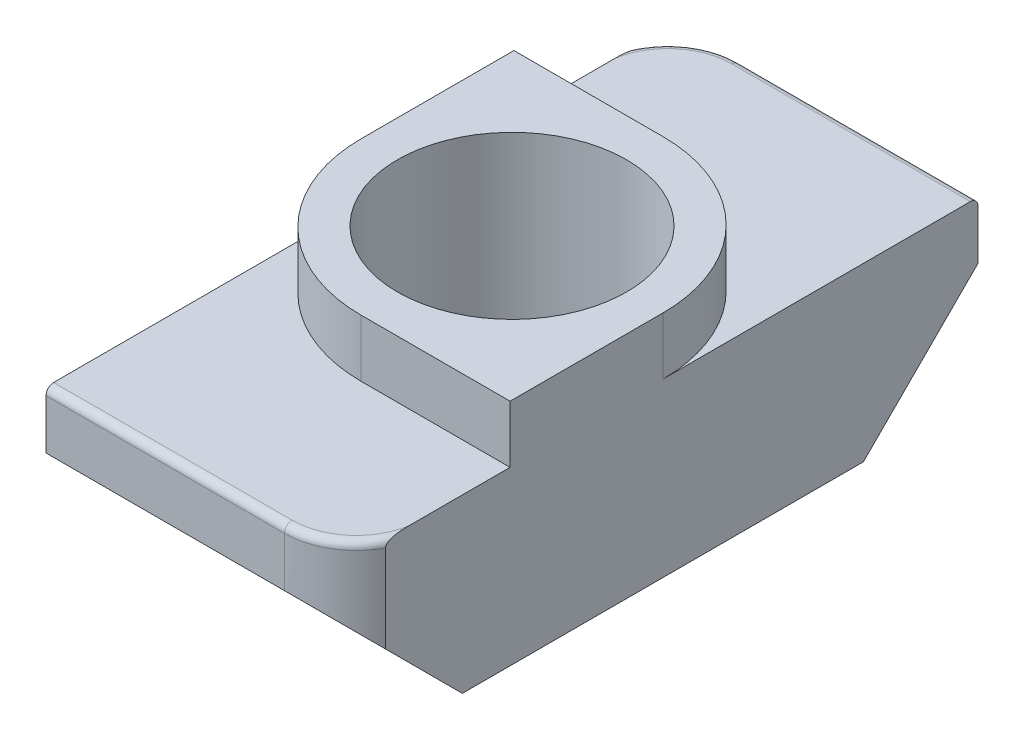
ISO-10303-21;
HEADER;
FILE_DESCRIPTION(('STEP AP214'),'2;1');
FILE_NAME('part.step','',(''),(''),'','','');
FILE_SCHEMA(('AUTOMOTIVE_DESIGN { 1 0 10303 214 1 1 1 1 }'));
ENDSEC;
DATA;
#1=APPLICATION_CONTEXT('core data for automotive mechanical design processes');
#2=APPLICATION_PROTOCOL_DEFINITION('international standard','automotive_design',2000,#1);
#3=PRODUCT_CONTEXT('',#1,'mechanical');
#4=PRODUCT('Part','Part','',(#3));
#5=PRODUCT_RELATED_PRODUCT_CATEGORY('part','',(#4));
#6=PRODUCT_DEFINITION_FORMATION('','',#4);
#7=PRODUCT_DEFINITION_CONTEXT('part definition',#1,'design');
#8=PRODUCT_DEFINITION('design','',#6,#7);
#9=PRODUCT_DEFINITION_SHAPE('','',#8);
#10=(LENGTH_UNIT() NAMED_UNIT(*) SI_UNIT(.MILLI.,.METRE.));
#11=(NAMED_UNIT(*) PLANE_ANGLE_UNIT() SI_UNIT($,.RADIAN.));
#12=(NAMED_UNIT(*) SI_UNIT($,.STERADIAN.) SOLID_ANGLE_UNIT());
#13=UNCERTAINTY_MEASURE_WITH_UNIT(LENGTH_MEASURE(1.E-05),#10,'distance_accuracy_value','');
#14=(GEOMETRIC_REPRESENTATION_CONTEXT(3) GLOBAL_UNCERTAINTY_ASSIGNED_CONTEXT((#13)) GLOBAL_UNIT_ASSIGNED_CONTEXT((#10,
#11,#12)) REPRESENTATION_CONTEXT('',''));
#15=CARTESIAN_POINT('',(0.,0.,0.));
#16=DIRECTION('',(0.,0.,1.));
#17=DIRECTION('',(1.,0.,0.));
#18=AXIS2_PLACEMENT_3D('',#15,#16,#17);
#19=CARTESIAN_POINT('',(-3.95,-1.5,4.));
#20=DIRECTION('',(0.,0.,1.));
#21=DIRECTION('',(-1.,0.,0.));
#22=AXIS2_PLACEMENT_3D('',#19,#20,#21);
#23=PLANE('',#22);
#24=DIRECTION('',(0.,1.,0.));
#25=VECTOR('',#24,1.);
#26=CARTESIAN_POINT('',(3.95,-1.5,4.));
#27=LINE('',#26,#25);
#28=CARTESIAN_POINT('',(3.95,0.,4.));
#29=VERTEX_POINT('',#28);
#30=CARTESIAN_POINT('',(3.95,-1.5,4.));
#31=VERTEX_POINT('',#30);
#32=EDGE_CURVE('E331',#29,#31,#27,.F.);
#33=ORIENTED_EDGE('',*,*,#32,.F.);
#34=DIRECTION('',(1.,0.,0.));
#35=VECTOR('',#34,1.);
#36=CARTESIAN_POINT('',(-3.95,0.,4.));
#37=LINE('',#36,#35);
#38=CARTESIAN_POINT('',(0.0500000000000003,0.,4.));
#39=VERTEX_POINT('',#38);
#40=EDGE_CURVE('E224',#29,#39,#37,.F.);
#41=ORIENTED_EDGE('',*,*,#40,.T.);
#42=DIRECTION('',(0.,1.,0.));
#43=VECTOR('',#42,1.);
#44=CARTESIAN_POINT('',(0.0500000000000005,0.,4.));
#45=LINE('',#44,#43);
#46=CARTESIAN_POINT('',(0.0500000000000003,-1.5,4.));
#47=VERTEX_POINT('',#46);
#48=EDGE_CURVE('E329',#39,#47,#45,.F.);
#49=ORIENTED_EDGE('',*,*,#48,.T.);
#50=DIRECTION('',(1.,0.,0.));
#51=VECTOR('',#50,1.);
#52=CARTESIAN_POINT('',(-3.95,-1.5,4.));
#53=LINE('',#52,#51);
#54=EDGE_CURVE('E237',#47,#31,#53,.T.);
#55=ORIENTED_EDGE('',*,*,#54,.T.);
#56=EDGE_LOOP('',(#33,#41,#49,#55));
#57=FACE_BOUND('',#56,.T.);
#58=ADVANCED_FACE('F33',(#57),#23,.T.);
#59=CARTESIAN_POINT('',(0.05,0.,0.));
#60=DIRECTION('',(0.,1.,0.));
#61=DIRECTION('',(0.,0.,-1.));
#62=AXIS2_PLACEMENT_3D('',#59,#60,#61);
#63=CYLINDRICAL_SURFACE('',#62,4.);
#64=CARTESIAN_POINT('',(0.05,-1.5,0.));
#65=DIRECTION('',(0.,-1.,0.));
#66=DIRECTION('',(0.,0.,-1.));
#67=AXIS2_PLACEMENT_3D('',#64,#65,#66);
#68=CIRCLE('',#67,4.);
#69=CARTESIAN_POINT('',(-3.95,-1.5,0.));
#70=VERTEX_POINT('',#69);
#71=EDGE_CURVE('E215',#70,#47,#68,.F.);
#72=ORIENTED_EDGE('',*,*,#71,.T.);
#73=ORIENTED_EDGE('',*,*,#48,.F.);
#74=CARTESIAN_POINT('',(0.05,0.,0.));
#75=DIRECTION('',(0.,-1.,0.));
#76=DIRECTION('',(0.,0.,-1.));
#77=AXIS2_PLACEMENT_3D('',#74,#75,#76);
#78=CIRCLE('',#77,4.);
#79=CARTESIAN_POINT('',(-3.95,0.,0.));
#80=VERTEX_POINT('',#79);
#81=EDGE_CURVE('E227',#39,#80,#78,.T.);
#82=ORIENTED_EDGE('',*,*,#81,.T.);
#83=DIRECTION('',(0.,1.,0.));
#84=VECTOR('',#83,1.);
#85=CARTESIAN_POINT('',(-3.95,0.,0.));
#86=LINE('',#85,#84);
#87=EDGE_CURVE('E276',#70,#80,#86,.T.);
#88=ORIENTED_EDGE('',*,*,#87,.F.);
#89=EDGE_LOOP('',(#72,#73,#82,#88));
#90=FACE_BOUND('',#89,.T.);
#91=ADVANCED_FACE('F433',(#90),#63,.T.);
#92=CARTESIAN_POINT('',(-0.05,0.,0.));
#93=DIRECTION('',(0.,1.,0.));
#94=DIRECTION('',(0.,0.,-1.));
#95=AXIS2_PLACEMENT_3D('',#92,#93,#94);
#96=CYLINDRICAL_SURFACE('',#95,4.);
#97=CARTESIAN_POINT('',(-0.05,-1.5,0.));
#98=DIRECTION('',(0.,-1.,0.));
#99=DIRECTION('',(0.,0.,-1.));
#100=AXIS2_PLACEMENT_3D('',#97,#98,#99);
#101=CIRCLE('',#100,4.);
#102=CARTESIAN_POINT('',(3.95,-1.5,0.));
#103=VERTEX_POINT('',#102);
#104=CARTESIAN_POINT('',(-0.0500000000000001,-1.5,-4.));
#105=VERTEX_POINT('',#104);
#106=EDGE_CURVE('E249',#103,#105,#101,.F.);
#107=ORIENTED_EDGE('',*,*,#106,.T.);
#108=DIRECTION('',(0.,1.,0.));
#109=VECTOR('',#108,1.);
#110=CARTESIAN_POINT('',(-0.0500000000000001,0.,-4.));
#111=LINE('',#110,#109);
#112=CARTESIAN_POINT('',(-0.0500000000000001,0.,-4.));
#113=VERTEX_POINT('',#112);
#114=EDGE_CURVE('E310',#105,#113,#111,.T.);
#115=ORIENTED_EDGE('',*,*,#114,.T.);
#116=CARTESIAN_POINT('',(-0.05,0.,0.));
#117=DIRECTION('',(0.,-1.,0.));
#118=DIRECTION('',(0.,0.,-1.));
#119=AXIS2_PLACEMENT_3D('',#116,#117,#118);
#120=CIRCLE('',#119,4.);
#121=CARTESIAN_POINT('',(3.95,0.,0.));
#122=VERTEX_POINT('',#121);
#123=EDGE_CURVE('E228',#113,#122,#120,.T.);
#124=ORIENTED_EDGE('',*,*,#123,.T.);
#125=DIRECTION('',(0.,1.,0.));
#126=VECTOR('',#125,1.);
#127=CARTESIAN_POINT('',(3.95,0.,0.));
#128=LINE('',#127,#126);
#129=EDGE_CURVE('E315',#103,#122,#128,.T.);
#130=ORIENTED_EDGE('',*,*,#129,.F.);
#131=EDGE_LOOP('',(#107,#115,#124,#130));
#132=FACE_BOUND('',#131,.T.);
#133=ADVANCED_FACE('F428',(#132),#96,.T.);
#134=CARTESIAN_POINT('',(-3.95,0.,-4.));
#135=DIRECTION('',(0.,0.,-1.));
#136=DIRECTION('',(1.,0.,0.));
#137=AXIS2_PLACEMENT_3D('',#134,#135,#136);
#138=PLANE('',#137);
#139=ORIENTED_EDGE('',*,*,#114,.F.);
#140=DIRECTION('',(1.,0.,0.));
#141=VECTOR('',#140,1.);
#142=CARTESIAN_POINT('',(-3.95,-1.5,-4.));
#143=LINE('',#142,#141);
#144=CARTESIAN_POINT('',(-3.95,-1.5,-4.));
#145=VERTEX_POINT('',#144);
#146=EDGE_CURVE('E244',#105,#145,#143,.F.);
#147=ORIENTED_EDGE('',*,*,#146,.T.);
#148=DIRECTION('',(0.,1.,0.));
#149=VECTOR('',#148,1.);
#150=CARTESIAN_POINT('',(-3.95,0.,-4.));
#151=LINE('',#150,#149);
#152=CARTESIAN_POINT('',(-3.95,0.,-4.));
#153=VERTEX_POINT('',#152);
#154=EDGE_CURVE('E308',#153,#145,#151,.F.);
#155=ORIENTED_EDGE('',*,*,#154,.F.);
#156=DIRECTION('',(1.,0.,0.));
#157=VECTOR('',#156,1.);
#158=CARTESIAN_POINT('',(-3.95,0.,-4.));
#159=LINE('',#158,#157);
#160=EDGE_CURVE('E231',#153,#113,#159,.T.);
#161=ORIENTED_EDGE('',*,*,#160,.T.);
#162=EDGE_LOOP('',(#139,#147,#155,#161));
#163=FACE_BOUND('',#162,.T.);
#164=ADVANCED_FACE('F442',(#163),#138,.T.);
#165=CARTESIAN_POINT('',(-3.95,-1.5,-8.25));
#166=DIRECTION('',(0.,0.,-1.));
#167=DIRECTION('',(1.,0.,0.));
#168=AXIS2_PLACEMENT_3D('',#165,#166,#167);
#169=PLANE('',#168);
#170=DIRECTION('',(0.,1.,0.));
#171=VECTOR('',#170,1.);
#172=CARTESIAN_POINT('',(-2.293413147463,-1.5,-8.25));
#173=LINE('',#172,#171);
#174=CARTESIAN_POINT('',(-2.293413147463,-3.,-8.25));
#175=VERTEX_POINT('',#174);
#176=CARTESIAN_POINT('',(-2.293413147463,-1.7,-8.25));
#177=VERTEX_POINT('',#176);
#178=EDGE_CURVE('E302',#175,#177,#173,.T.);
#179=ORIENTED_EDGE('',*,*,#178,.T.);
#180=DIRECTION('',(1.,0.,0.));
#181=VECTOR('',#180,1.);
#182=CARTESIAN_POINT('',(-3.95,-1.7,-8.25));
#183=LINE('',#182,#181);
#184=CARTESIAN_POINT('',(3.95,-1.7,-8.25));
#185=VERTEX_POINT('',#184);
#186=EDGE_CURVE('E11',#177,#185,#183,.T.);
#187=ORIENTED_EDGE('',*,*,#186,.T.);
#188=DIRECTION('',(0.,1.,0.));
#189=VECTOR('',#188,1.);
#190=CARTESIAN_POINT('',(3.95,-1.5,-8.25));
#191=LINE('',#190,#189);
#192=CARTESIAN_POINT('',(3.95,-3.,-8.25));
#193=VERTEX_POINT('',#192);
#194=EDGE_CURVE('E304',#193,#185,#191,.T.);
#195=ORIENTED_EDGE('',*,*,#194,.F.);
#196=DIRECTION('',(1.,0.,0.));
#197=VECTOR('',#196,1.);
#198=CARTESIAN_POINT('',(-3.95,-3.,-8.25));
#199=LINE('',#198,#197);
#200=EDGE_CURVE('E243',#193,#175,#199,.F.);
#201=ORIENTED_EDGE('',*,*,#200,.T.);
#202=EDGE_LOOP('',(#179,#187,#195,#201));
#203=FACE_BOUND('',#202,.T.);
#204=ADVANCED_FACE('F420',(#203),#169,.T.);
#205=CARTESIAN_POINT('',(-2.293413147463,-1.5,-6.369));
#206=DIRECTION('',(0.,1.,0.));
#207=DIRECTION('',(0.,0.,-1.));
#208=AXIS2_PLACEMENT_3D('',#205,#206,#207);
#209=CYLINDRICAL_SURFACE('',#208,1.881);
#210=DIRECTION('',(0.,1.,0.));
#211=VECTOR('',#210,1.);
#212=CARTESIAN_POINT('',(-3.95,0.,-7.26));
#213=LINE('',#212,#211);
#214=CARTESIAN_POINT('',(-3.95,-1.7,-7.26));
#215=VERTEX_POINT('',#214);
#216=CARTESIAN_POINT('',(-3.95,-3.98999999999956,-7.26000000000044));
#217=VERTEX_POINT('',#216);
#218=EDGE_CURVE('E319',#215,#217,#213,.F.);
#219=ORIENTED_EDGE('',*,*,#218,.F.);
#220=CARTESIAN_POINT('',(-2.293413147463,-1.7,-6.369));
#221=DIRECTION('',(0.,1.,0.));
#222=DIRECTION('',(0.,0.,1.));
#223=AXIS2_PLACEMENT_3D('',#220,#221,#222);
#224=CIRCLE('',#223,1.881);
#225=EDGE_CURVE('E397',#215,#177,#224,.F.);
#226=ORIENTED_EDGE('',*,*,#225,.T.);
#227=ORIENTED_EDGE('',*,*,#178,.F.);
#228=CARTESIAN_POINT('',(-2.293413147463,-4.881,-6.369));
#229=DIRECTION('',(0.,0.707106781186548,0.707106781186548));
#230=DIRECTION('',(0.,0.707106781186548,-0.707106781186548));
#231=AXIS2_PLACEMENT_3D('',#228,#229,#230);
#232=ELLIPSE('',#231,2.66013571082379,1.881);
#233=EDGE_CURVE('E254',#175,#217,#232,.T.);
#234=ORIENTED_EDGE('',*,*,#233,.T.);
#235=EDGE_LOOP('',(#219,#226,#227,#234));
#236=FACE_BOUND('',#235,.T.);
#237=ADVANCED_FACE('F418',(#236),#209,.T.);
#238=CARTESIAN_POINT('',(0.,0.,0.));
#239=DIRECTION('',(0.,1.,0.));
#240=DIRECTION('',(0.,0.,-1.));
#241=AXIS2_PLACEMENT_3D('',#238,#239,#240);
#242=CYLINDRICAL_SURFACE('',#241,3.);
#243=CARTESIAN_POINT('',(0.,0.,0.));
#244=DIRECTION('',(0.,-1.,0.));
#245=DIRECTION('',(0.,0.,-1.));
#246=AXIS2_PLACEMENT_3D('',#243,#244,#245);
#247=CIRCLE('',#246,3.);
#248=CARTESIAN_POINT('',(0.,0.,-3.));
#249=VERTEX_POINT('',#248);
#250=EDGE_CURVE('E284',#249,#249,#247,.F.);
#251=ORIENTED_EDGE('',*,*,#250,.T.);
#252=EDGE_LOOP('',(#251));
#253=FACE_BOUND('',#252,.T.);
#254=CARTESIAN_POINT('',(0.,-6.,0.));
#255=DIRECTION('',(0.,-1.,0.));
#256=DIRECTION('',(0.,0.,-1.));
#257=AXIS2_PLACEMENT_3D('',#254,#255,#256);
#258=CIRCLE('',#257,3.);
#259=CARTESIAN_POINT('',(0.,-6.,-3.));
#260=VERTEX_POINT('',#259);
#261=EDGE_CURVE('E175',#260,#260,#258,.T.);
#262=ORIENTED_EDGE('',*,*,#261,.T.);
#263=EDGE_LOOP('',(#262));
#264=FACE_BOUND('',#263,.T.);
#265=ADVANCED_FACE('F356',(#253,#264),#242,.F.);
#266=CARTESIAN_POINT('',(-3.95,0.,0.));
#267=DIRECTION('',(1.,0.,0.));
#268=DIRECTION('',(0.,0.,1.));
#269=AXIS2_PLACEMENT_3D('',#266,#267,#268);
#270=PLANE('',#269);
#271=DIRECTION('',(0.,0.,-1.));
#272=VECTOR('',#271,1.);
#273=CARTESIAN_POINT('',(-3.95,-1.5,-4.));
#274=LINE('',#273,#272);
#275=CARTESIAN_POINT('',(-3.95,-1.5,-6.65444876948685));
#276=VERTEX_POINT('',#275);
#277=EDGE_CURVE('E240',#145,#276,#274,.T.);
#278=ORIENTED_EDGE('',*,*,#277,.T.);
#279=CARTESIAN_POINT('',(-3.95,-1.5,-6.65444876948685));
#280=CARTESIAN_POINT('',(-3.95,-1.50003461063189,-6.68766661005385));
#281=CARTESIAN_POINT('',(-3.95,-1.50024182081215,-6.72090936158904));
#282=CARTESIAN_POINT('',(-3.95,-1.50172285700167,-6.78763890217931));
#283=CARTESIAN_POINT('',(-3.95,-1.50300537870805,-6.82112546743208));
#284=CARTESIAN_POINT('',(-3.95,-1.50739841176135,-6.88825069878532));
#285=CARTESIAN_POINT('',(-3.95,-1.51052300007803,-6.92188853500052));
#286=CARTESIAN_POINT('',(-3.95,-1.51971009903734,-6.98869959253312));
#287=CARTESIAN_POINT('',(-3.95,-1.52576145909157,-7.02187408950636));
#288=CARTESIAN_POINT('',(-3.95,-1.5375904701501,-7.06773104892723));
#289=CARTESIAN_POINT('',(-3.95,-1.54140764010483,-7.08091360345249));
#290=CARTESIAN_POINT('',(-3.95,-1.55003754835498,-7.10701354085408));
#291=CARTESIAN_POINT('',(-3.95,-1.55485416809254,-7.11992966736706));
#292=CARTESIAN_POINT('',(-3.95,-1.56714879282446,-7.14861754226266));
#293=CARTESIAN_POINT('',(-3.95,-1.57499390762531,-7.16423555373474));
#294=CARTESIAN_POINT('',(-3.95,-1.59330316118516,-7.19384194671935));
#295=CARTESIAN_POINT('',(-3.95,-1.60374697446465,-7.20784179493034));
#296=CARTESIAN_POINT('',(-3.95,-1.62071158728762,-7.22503563218095));
#297=CARTESIAN_POINT('',(-3.95,-1.62578759867699,-7.22964602709946));
#298=CARTESIAN_POINT('',(-3.95,-1.63652339047188,-7.23815140438876));
#299=CARTESIAN_POINT('',(-3.95,-1.6421835023561,-7.24204597700322));
#300=CARTESIAN_POINT('',(-3.95,-1.65414660877853,-7.2489155725215));
#301=CARTESIAN_POINT('',(-3.95,-1.66045706667905,-7.25187785425573));
#302=CARTESIAN_POINT('',(-3.95,-1.67352898311595,-7.25651353861866));
#303=CARTESIAN_POINT('',(-3.95,-1.68028863996115,-7.25819178800322));
#304=CARTESIAN_POINT('',(-3.95,-1.68926914046244,-7.25941622165966));
#305=CARTESIAN_POINT('',(-3.95,-1.69140917389614,-7.25963473248844));
#306=CARTESIAN_POINT('',(-3.95,-1.69569906929852,-7.25992653534938));
#307=CARTESIAN_POINT('',(-3.95,-1.69784893106853,-7.25999983030398));
#308=CARTESIAN_POINT('',(-3.95,-1.6999999999999,-7.26000000000095));
#309=B_SPLINE_CURVE_WITH_KNOTS('',3,(#279,#280,#281,#282,#283,#284,#285,#286,#287,#288,#289,
#290,#291,#292,#293,#294,#295,#296,#297,#298,#299,#300,#301,#302,#303,#304,#305,#306,#307,#308),
.UNSPECIFIED.,.F.,.F.,(4,2,2,2,2,2,2,2,2,2,2,2,2,2,4),(0.,0.0996945055427077,0.200203072325516,
0.301489862396235,0.402393767994543,0.443537192015457,0.484843495017986,0.537131500314813,
0.589022732355215,0.609546495088568,0.630081969844489,0.650886996394867,0.671613098713704,
0.67806281694801,0.684512405381557),.UNSPECIFIED.);
#310=EDGE_CURVE('E339',#276,#215,#309,.T.);
#311=ORIENTED_EDGE('',*,*,#310,.T.);
#312=ORIENTED_EDGE('',*,*,#218,.T.);
#313=DIRECTION('',(0.,-0.707106781186548,0.707106781186548));
#314=VECTOR('',#313,1.);
#315=CARTESIAN_POINT('',(-3.95,-3.,-8.25));
#316=LINE('',#315,#314);
#317=CARTESIAN_POINT('',(-3.95,-6.,-5.25));
#318=VERTEX_POINT('',#317);
#319=EDGE_CURVE('E191',#217,#318,#316,.T.);
#320=ORIENTED_EDGE('',*,*,#319,.T.);
#321=DIRECTION('',(0.,0.,1.));
#322=VECTOR('',#321,1.);
#323=CARTESIAN_POINT('',(-3.95,-6.,-5.25));
#324=LINE('',#323,#322);
#325=CARTESIAN_POINT('',(-3.95,-6.,5.25));
#326=VERTEX_POINT('',#325);
#327=EDGE_CURVE('E190',#318,#326,#324,.T.);
#328=ORIENTED_EDGE('',*,*,#327,.T.);
#329=DIRECTION('',(0.,0.707106781186548,0.707106781186548));
#330=VECTOR('',#329,1.);
#331=CARTESIAN_POINT('',(-3.95,-6.,5.25));
#332=LINE('',#331,#330);
#333=CARTESIAN_POINT('',(-3.95,-3.,8.25));
#334=VERTEX_POINT('',#333);
#335=EDGE_CURVE('E171',#326,#334,#332,.T.);
#336=ORIENTED_EDGE('',*,*,#335,.T.);
#337=DIRECTION('',(0.,1.,0.));
#338=VECTOR('',#337,1.);
#339=CARTESIAN_POINT('',(-3.95,-3.,8.25));
#340=LINE('',#339,#338);
#341=CARTESIAN_POINT('',(-3.95,-1.7,8.25));
#342=VERTEX_POINT('',#341);
#343=EDGE_CURVE('E206',#334,#342,#340,.T.);
#344=ORIENTED_EDGE('',*,*,#343,.T.);
#345=CARTESIAN_POINT('',(-3.95,-1.7,8.05));
#346=DIRECTION('',(1.,0.,0.));
#347=DIRECTION('',(0.,0.,-1.));
#348=AXIS2_PLACEMENT_3D('',#345,#346,#347);
#349=CIRCLE('',#348,0.2);
#350=CARTESIAN_POINT('',(-3.95,-1.5,8.05));
#351=VERTEX_POINT('',#350);
#352=EDGE_CURVE('E345',#342,#351,#349,.F.);
#353=ORIENTED_EDGE('',*,*,#352,.T.);
#354=DIRECTION('',(0.,0.,-1.));
#355=VECTOR('',#354,1.);
#356=CARTESIAN_POINT('',(-3.95,-1.5,-4.));
#357=LINE('',#356,#355);
#358=EDGE_CURVE('E212',#351,#70,#357,.T.);
#359=ORIENTED_EDGE('',*,*,#358,.T.);
#360=ORIENTED_EDGE('',*,*,#87,.T.);
#361=DIRECTION('',(0.,0.,-1.));
#362=VECTOR('',#361,1.);
#363=CARTESIAN_POINT('',(-3.95,0.,4.));
#364=LINE('',#363,#362);
#365=EDGE_CURVE('E233',#80,#153,#364,.T.);
#366=ORIENTED_EDGE('',*,*,#365,.T.);
#367=ORIENTED_EDGE('',*,*,#154,.T.);
#368=EDGE_LOOP('',(#278,#311,#312,#320,#328,#336,#344,#353,#359,#360,#366,#367));
#369=FACE_BOUND('',#368,.T.);
#370=ADVANCED_FACE('F350',(#369),#270,.F.);
#371=CARTESIAN_POINT('',(-3.95,-3.,8.25));
#372=DIRECTION('',(0.,0.,1.));
#373=DIRECTION('',(-1.,0.,0.));
#374=AXIS2_PLACEMENT_3D('',#371,#372,#373);
#375=PLANE('',#374);
#376=DIRECTION('',(0.,1.,0.));
#377=VECTOR('',#376,1.);
#378=CARTESIAN_POINT('',(2.293413147463,-1.5,8.25));
#379=LINE('',#378,#377);
#380=CARTESIAN_POINT('',(2.293413147463,-3.,8.25));
#381=VERTEX_POINT('',#380);
#382=CARTESIAN_POINT('',(2.293413147463,-1.7,8.25));
#383=VERTEX_POINT('',#382);
#384=EDGE_CURVE('E216',#381,#383,#379,.T.);
#385=ORIENTED_EDGE('',*,*,#384,.T.);
#386=DIRECTION('',(-1.,0.,0.));
#387=VECTOR('',#386,1.);
#388=CARTESIAN_POINT('',(-3.95,-1.7,8.25));
#389=LINE('',#388,#387);
#390=EDGE_CURVE('E42',#383,#342,#389,.T.);
#391=ORIENTED_EDGE('',*,*,#390,.T.);
#392=ORIENTED_EDGE('',*,*,#343,.F.);
#393=DIRECTION('',(1.,0.,0.));
#394=VECTOR('',#393,1.);
#395=CARTESIAN_POINT('',(-3.95,-3.,8.25));
#396=LINE('',#395,#394);
#397=EDGE_CURVE('E261',#334,#381,#396,.T.);
#398=ORIENTED_EDGE('',*,*,#397,.T.);
#399=EDGE_LOOP('',(#385,#391,#392,#398));
#400=FACE_BOUND('',#399,.T.);
#401=ADVANCED_FACE('F355',(#400),#375,.T.);
#402=CARTESIAN_POINT('',(2.293413147463,-1.5,6.369));
#403=DIRECTION('',(0.,1.,0.));
#404=DIRECTION('',(0.,0.,-1.));
#405=AXIS2_PLACEMENT_3D('',#402,#403,#404);
#406=CYLINDRICAL_SURFACE('',#405,1.881);
#407=DIRECTION('',(0.,1.,0.));
#408=VECTOR('',#407,1.);
#409=CARTESIAN_POINT('',(3.95,0.,7.26));
#410=LINE('',#409,#408);
#411=CARTESIAN_POINT('',(3.95,-3.98999999999957,7.26000000000043));
#412=VERTEX_POINT('',#411);
#413=CARTESIAN_POINT('',(3.95,-1.7,7.26));
#414=VERTEX_POINT('',#413);
#415=EDGE_CURVE('E162',#412,#414,#410,.T.);
#416=ORIENTED_EDGE('',*,*,#415,.T.);
#417=CARTESIAN_POINT('',(2.293413147463,-1.7,6.369));
#418=DIRECTION('',(0.,1.,0.));
#419=DIRECTION('',(0.,0.,1.));
#420=AXIS2_PLACEMENT_3D('',#417,#418,#419);
#421=CIRCLE('',#420,1.881);
#422=EDGE_CURVE('E165',#414,#383,#421,.F.);
#423=ORIENTED_EDGE('',*,*,#422,.T.);
#424=ORIENTED_EDGE('',*,*,#384,.F.);
#425=CARTESIAN_POINT('',(2.293413147463,-4.881,6.369));
#426=DIRECTION('',(0.,0.707106781186548,-0.707106781186548));
#427=DIRECTION('',(0.,0.707106781186548,0.707106781186548));
#428=AXIS2_PLACEMENT_3D('',#425,#426,#427);
#429=ELLIPSE('',#428,2.66013571082379,1.881);
#430=EDGE_CURVE('E264',#381,#412,#429,.T.);
#431=ORIENTED_EDGE('',*,*,#430,.T.);
#432=EDGE_LOOP('',(#416,#423,#424,#431));
#433=FACE_BOUND('',#432,.T.);
#434=ADVANCED_FACE('F361',(#433),#406,.T.);
#435=CARTESIAN_POINT('',(-3.95,-1.5,-4.));
#436=DIRECTION('',(0.,1.,0.));
#437=DIRECTION('',(0.,0.,-1.));
#438=AXIS2_PLACEMENT_3D('',#435,#436,#437);
#439=PLANE('',#438);
#440=DIRECTION('',(-1.,0.,0.));
#441=VECTOR('',#440,1.);
#442=CARTESIAN_POINT('',(-3.95,-1.5,8.05));
#443=LINE('',#442,#441);
#444=CARTESIAN_POINT('',(2.293413147463,-1.5,8.05));
#445=VERTEX_POINT('',#444);
#446=EDGE_CURVE('E217',#351,#445,#443,.F.);
#447=ORIENTED_EDGE('',*,*,#446,.T.);
#448=CARTESIAN_POINT('',(2.293413147463,-1.5,6.369));
#449=DIRECTION('',(0.,1.,0.));
#450=DIRECTION('',(0.,0.,1.));
#451=AXIS2_PLACEMENT_3D('',#448,#449,#450);
#452=CIRCLE('',#451,1.681);
#453=CARTESIAN_POINT('',(3.95,-1.5,6.65444876948685));
#454=VERTEX_POINT('',#453);
#455=EDGE_CURVE('E406',#445,#454,#452,.T.);
#456=ORIENTED_EDGE('',*,*,#455,.T.);
#457=DIRECTION('',(0.,0.,1.));
#458=VECTOR('',#457,1.);
#459=CARTESIAN_POINT('',(3.95,-1.5,0.));
#460=LINE('',#459,#458);
#461=EDGE_CURVE('E201',#454,#31,#460,.F.);
#462=ORIENTED_EDGE('',*,*,#461,.T.);
#463=ORIENTED_EDGE('',*,*,#54,.F.);
#464=ORIENTED_EDGE('',*,*,#71,.F.);
#465=ORIENTED_EDGE('',*,*,#358,.F.);
#466=EDGE_LOOP('',(#447,#456,#462,#463,#464,#465));
#467=FACE_BOUND('',#466,.T.);
#468=ADVANCED_FACE('F364',(#467),#439,.T.);
#469=CARTESIAN_POINT('',(-3.95,0.,4.));
#470=DIRECTION('',(0.,1.,0.));
#471=DIRECTION('',(0.,0.,-1.));
#472=AXIS2_PLACEMENT_3D('',#469,#470,#471);
#473=PLANE('',#472);
#474=ORIENTED_EDGE('',*,*,#250,.F.);
#475=EDGE_LOOP('',(#474));
#476=FACE_BOUND('',#475,.T.);
#477=ORIENTED_EDGE('',*,*,#40,.F.);
#478=DIRECTION('',(0.,0.,1.));
#479=VECTOR('',#478,1.);
#480=CARTESIAN_POINT('',(3.95,0.,0.));
#481=LINE('',#480,#479);
#482=EDGE_CURVE('E197',#29,#122,#481,.F.);
#483=ORIENTED_EDGE('',*,*,#482,.T.);
#484=ORIENTED_EDGE('',*,*,#123,.F.);
#485=ORIENTED_EDGE('',*,*,#160,.F.);
#486=ORIENTED_EDGE('',*,*,#365,.F.);
#487=ORIENTED_EDGE('',*,*,#81,.F.);
#488=EDGE_LOOP('',(#477,#483,#484,#485,#486,#487));
#489=FACE_BOUND('',#488,.T.);
#490=ADVANCED_FACE('F367',(#476,#489),#473,.T.);
#491=CARTESIAN_POINT('',(-3.95,-1.5,-4.));
#492=DIRECTION('',(0.,1.,0.));
#493=DIRECTION('',(0.,0.,-1.));
#494=AXIS2_PLACEMENT_3D('',#491,#492,#493);
#495=PLANE('',#494);
#496=DIRECTION('',(1.,0.,0.));
#497=VECTOR('',#496,1.);
#498=CARTESIAN_POINT('',(-3.95,-1.5,-8.05));
#499=LINE('',#498,#497);
#500=CARTESIAN_POINT('',(3.95,-1.5,-8.05));
#501=VERTEX_POINT('',#500);
#502=CARTESIAN_POINT('',(-2.293413147463,-1.5,-8.05));
#503=VERTEX_POINT('',#502);
#504=EDGE_CURVE('E57',#501,#503,#499,.F.);
#505=ORIENTED_EDGE('',*,*,#504,.T.);
#506=CARTESIAN_POINT('',(-2.293413147463,-1.5,-6.369));
#507=DIRECTION('',(0.,1.,0.));
#508=DIRECTION('',(0.,0.,1.));
#509=AXIS2_PLACEMENT_3D('',#506,#507,#508);
#510=CIRCLE('',#509,1.681);
#511=EDGE_CURVE('E401',#503,#276,#510,.T.);
#512=ORIENTED_EDGE('',*,*,#511,.T.);
#513=ORIENTED_EDGE('',*,*,#277,.F.);
#514=ORIENTED_EDGE('',*,*,#146,.F.);
#515=ORIENTED_EDGE('',*,*,#106,.F.);
#516=DIRECTION('',(0.,0.,1.));
#517=VECTOR('',#516,1.);
#518=CARTESIAN_POINT('',(3.95,-1.5,0.));
#519=LINE('',#518,#517);
#520=EDGE_CURVE('E182',#103,#501,#519,.F.);
#521=ORIENTED_EDGE('',*,*,#520,.T.);
#522=EDGE_LOOP('',(#505,#512,#513,#514,#515,#521));
#523=FACE_BOUND('',#522,.T.);
#524=ADVANCED_FACE('F371',(#523),#495,.T.);
#525=CARTESIAN_POINT('',(-3.95,-3.,-8.25));
#526=DIRECTION('',(0.,-0.707106781186548,-0.707106781186548));
#527=DIRECTION('',(0.,-0.707106781186548,0.707106781186548));
#528=AXIS2_PLACEMENT_3D('',#525,#526,#527);
#529=PLANE('',#528);
#530=ORIENTED_EDGE('',*,*,#233,.F.);
#531=ORIENTED_EDGE('',*,*,#200,.F.);
#532=DIRECTION('',(0.,-0.707106781186548,0.707106781186548));
#533=VECTOR('',#532,1.);
#534=CARTESIAN_POINT('',(3.95,-3.,-8.25));
#535=LINE('',#534,#533);
#536=CARTESIAN_POINT('',(3.95,-6.,-5.25));
#537=VERTEX_POINT('',#536);
#538=EDGE_CURVE('E180',#193,#537,#535,.T.);
#539=ORIENTED_EDGE('',*,*,#538,.T.);
#540=DIRECTION('',(1.,0.,0.));
#541=VECTOR('',#540,1.);
#542=CARTESIAN_POINT('',(-3.95,-6.,-5.25));
#543=LINE('',#542,#541);
#544=EDGE_CURVE('E178',#537,#318,#543,.F.);
#545=ORIENTED_EDGE('',*,*,#544,.T.);
#546=ORIENTED_EDGE('',*,*,#319,.F.);
#547=EDGE_LOOP('',(#530,#531,#539,#545,#546));
#548=FACE_BOUND('',#547,.T.);
#549=ADVANCED_FACE('F375',(#548),#529,.T.);
#550=CARTESIAN_POINT('',(-3.95,-6.,-5.25));
#551=DIRECTION('',(0.,-1.,0.));
#552=DIRECTION('',(0.,0.,1.));
#553=AXIS2_PLACEMENT_3D('',#550,#551,#552);
#554=PLANE('',#553);
#555=ORIENTED_EDGE('',*,*,#261,.F.);
#556=EDGE_LOOP('',(#555));
#557=FACE_BOUND('',#556,.T.);
#558=ORIENTED_EDGE('',*,*,#544,.F.);
#559=DIRECTION('',(0.,0.,1.));
#560=VECTOR('',#559,1.);
#561=CARTESIAN_POINT('',(3.95,-6.,0.));
#562=LINE('',#561,#560);
#563=CARTESIAN_POINT('',(3.95,-6.,5.25));
#564=VERTEX_POINT('',#563);
#565=EDGE_CURVE('E159',#537,#564,#562,.T.);
#566=ORIENTED_EDGE('',*,*,#565,.T.);
#567=DIRECTION('',(1.,0.,0.));
#568=VECTOR('',#567,1.);
#569=CARTESIAN_POINT('',(-3.95,-6.,5.25));
#570=LINE('',#569,#568);
#571=EDGE_CURVE('E168',#564,#326,#570,.F.);
#572=ORIENTED_EDGE('',*,*,#571,.T.);
#573=ORIENTED_EDGE('',*,*,#327,.F.);
#574=EDGE_LOOP('',(#558,#566,#572,#573));
#575=FACE_BOUND('',#574,.T.);
#576=ADVANCED_FACE('F177',(#557,#575),#554,.T.);
#577=CARTESIAN_POINT('',(-3.95,-6.,5.25));
#578=DIRECTION('',(0.,-0.707106781186548,0.707106781186548));
#579=DIRECTION('',(0.,0.707106781186548,0.707106781186548));
#580=AXIS2_PLACEMENT_3D('',#577,#578,#579);
#581=PLANE('',#580);
#582=ORIENTED_EDGE('',*,*,#430,.F.);
#583=ORIENTED_EDGE('',*,*,#397,.F.);
#584=ORIENTED_EDGE('',*,*,#335,.F.);
#585=ORIENTED_EDGE('',*,*,#571,.F.);
#586=DIRECTION('',(0.,0.707106781186547,0.707106781186547));
#587=VECTOR('',#586,1.);
#588=CARTESIAN_POINT('',(3.95,-6.,5.25));
#589=LINE('',#588,#587);
#590=EDGE_CURVE('E154',#564,#412,#589,.T.);
#591=ORIENTED_EDGE('',*,*,#590,.T.);
#592=EDGE_LOOP('',(#582,#583,#584,#585,#591));
#593=FACE_BOUND('',#592,.T.);
#594=ADVANCED_FACE('F169',(#593),#581,.T.);
#595=CARTESIAN_POINT('',(3.95,0.,0.));
#596=DIRECTION('',(1.,0.,0.));
#597=DIRECTION('',(0.,0.,1.));
#598=AXIS2_PLACEMENT_3D('',#595,#596,#597);
#599=PLANE('',#598);
#600=ORIENTED_EDGE('',*,*,#461,.F.);
#601=CARTESIAN_POINT('',(3.95,-1.5,6.65444876948685));
#602=CARTESIAN_POINT('',(3.95,-1.50003461063189,6.68766661005385));
#603=CARTESIAN_POINT('',(3.95,-1.50024182081215,6.72090936158904));
#604=CARTESIAN_POINT('',(3.95,-1.50172285700167,6.78763890217931));
#605=CARTESIAN_POINT('',(3.95,-1.50300537870805,6.82112546743208));
#606=CARTESIAN_POINT('',(3.95,-1.50739841176135,6.88825069878532));
#607=CARTESIAN_POINT('',(3.95,-1.51052300007803,6.92188853500052));
#608=CARTESIAN_POINT('',(3.95,-1.51971009903734,6.98869959253312));
#609=CARTESIAN_POINT('',(3.95,-1.52576145909157,7.02187408950636));
#610=CARTESIAN_POINT('',(3.95,-1.5375904701501,7.06773104892723));
#611=CARTESIAN_POINT('',(3.95,-1.54140764010483,7.08091360345249));
#612=CARTESIAN_POINT('',(3.95,-1.55003754835498,7.10701354085408));
#613=CARTESIAN_POINT('',(3.95,-1.55485416809254,7.11992966736706));
#614=CARTESIAN_POINT('',(3.95,-1.56714879282446,7.14861754226266));
#615=CARTESIAN_POINT('',(3.95,-1.57499390762531,7.16423555373474));
#616=CARTESIAN_POINT('',(3.95,-1.59330316118516,7.19384194671935));
#617=CARTESIAN_POINT('',(3.95,-1.60374697446465,7.20784179493034));
#618=CARTESIAN_POINT('',(3.95,-1.62071158728762,7.22503563218095));
#619=CARTESIAN_POINT('',(3.95,-1.62578759867699,7.22964602709946));
#620=CARTESIAN_POINT('',(3.95,-1.63652339047188,7.23815140438876));
#621=CARTESIAN_POINT('',(3.95,-1.6421835023561,7.24204597700322));
#622=CARTESIAN_POINT('',(3.95,-1.65414660877853,7.2489155725215));
#623=CARTESIAN_POINT('',(3.95,-1.66045706667905,7.25187785425573));
#624=CARTESIAN_POINT('',(3.95,-1.67352898311595,7.25651353861866));
#625=CARTESIAN_POINT('',(3.95,-1.68028863996115,7.25819178800322));
#626=CARTESIAN_POINT('',(3.95,-1.68926914046244,7.25941622165966));
#627=CARTESIAN_POINT('',(3.95,-1.69140917389614,7.25963473248844));
#628=CARTESIAN_POINT('',(3.95,-1.69569906929852,7.25992653534938));
#629=CARTESIAN_POINT('',(3.95,-1.69784893106853,7.25999983030398));
#630=CARTESIAN_POINT('',(3.95,-1.6999999999999,7.26000000000095));
#631=B_SPLINE_CURVE_WITH_KNOTS('',3,(#601,#602,#603,#604,#605,#606,#607,#608,#609,#610,#611,
#612,#613,#614,#615,#616,#617,#618,#619,#620,#621,#622,#623,#624,#625,#626,#627,#628,#629,#630),
.UNSPECIFIED.,.F.,.F.,(4,2,2,2,2,2,2,2,2,2,2,2,2,2,4),(0.,0.0996945055427077,0.200203072325516,
0.301489862396235,0.402393767994543,0.443537192015457,0.484843495017986,0.537131500314813,
0.589022732355215,0.609546495088568,0.630081969844489,0.650886996394867,0.671613098713704,
0.67806281694801,0.684512405381557),.UNSPECIFIED.);
#632=EDGE_CURVE('E391',#454,#414,#631,.T.);
#633=ORIENTED_EDGE('',*,*,#632,.T.);
#634=ORIENTED_EDGE('',*,*,#415,.F.);
#635=ORIENTED_EDGE('',*,*,#590,.F.);
#636=ORIENTED_EDGE('',*,*,#565,.F.);
#637=ORIENTED_EDGE('',*,*,#538,.F.);
#638=ORIENTED_EDGE('',*,*,#194,.T.);
#639=CARTESIAN_POINT('',(3.95,-1.7,-8.05));
#640=DIRECTION('',(1.,0.,0.));
#641=DIRECTION('',(0.,0.,-1.));
#642=AXIS2_PLACEMENT_3D('',#639,#640,#641);
#643=CIRCLE('',#642,0.2);
#644=EDGE_CURVE('E398',#185,#501,#643,.T.);
#645=ORIENTED_EDGE('',*,*,#644,.T.);
#646=ORIENTED_EDGE('',*,*,#520,.F.);
#647=ORIENTED_EDGE('',*,*,#129,.T.);
#648=ORIENTED_EDGE('',*,*,#482,.F.);
#649=ORIENTED_EDGE('',*,*,#32,.T.);
#650=EDGE_LOOP('',(#600,#633,#634,#635,#636,#637,#638,#645,#646,#647,#648,#649));
#651=FACE_BOUND('',#650,.T.);
#652=ADVANCED_FACE('F157',(#651),#599,.T.);
#653=CARTESIAN_POINT('',(-3.95,-1.7,8.05));
#654=DIRECTION('',(-1.,0.,0.));
#655=DIRECTION('',(0.,0.,1.));
#656=AXIS2_PLACEMENT_3D('',#653,#654,#655);
#657=CYLINDRICAL_SURFACE('',#656,0.2);
#658=ORIENTED_EDGE('',*,*,#352,.F.);
#659=ORIENTED_EDGE('',*,*,#390,.F.);
#660=CARTESIAN_POINT('',(2.293413147463,-1.7,8.05));
#661=DIRECTION('',(1.,0.,0.));
#662=DIRECTION('',(0.,0.,-1.));
#663=AXIS2_PLACEMENT_3D('',#660,#661,#662);
#664=CIRCLE('',#663,0.2);
#665=EDGE_CURVE('E332',#445,#383,#664,.T.);
#666=ORIENTED_EDGE('',*,*,#665,.F.);
#667=ORIENTED_EDGE('',*,*,#446,.F.);
#668=EDGE_LOOP('',(#658,#659,#666,#667));
#669=FACE_BOUND('',#668,.T.);
#670=ADVANCED_FACE('F387',(#669),#657,.T.);
#671=CARTESIAN_POINT('',(2.293413147463,-1.7,6.369));
#672=DIRECTION('',(0.,1.,0.));
#673=DIRECTION('',(0.,0.,1.));
#674=AXIS2_PLACEMENT_3D('',#671,#672,#673);
#675=TOROIDAL_SURFACE('',#674,1.681,0.2);
#676=ORIENTED_EDGE('',*,*,#632,.F.);
#677=ORIENTED_EDGE('',*,*,#455,.F.);
#678=ORIENTED_EDGE('',*,*,#665,.T.);
#679=ORIENTED_EDGE('',*,*,#422,.F.);
#680=EDGE_LOOP('',(#676,#677,#678,#679));
#681=FACE_BOUND('',#680,.T.);
#682=ADVANCED_FACE('F388',(#681),#675,.T.);
#683=CARTESIAN_POINT('',(-3.95,-1.7,-8.05));
#684=DIRECTION('',(1.,0.,0.));
#685=DIRECTION('',(0.,0.,-1.));
#686=AXIS2_PLACEMENT_3D('',#683,#684,#685);
#687=CYLINDRICAL_SURFACE('',#686,0.2);
#688=ORIENTED_EDGE('',*,*,#644,.F.);
#689=ORIENTED_EDGE('',*,*,#186,.F.);
#690=CARTESIAN_POINT('',(-2.293413147463,-1.7,-8.05));
#691=DIRECTION('',(-1.,0.,0.));
#692=DIRECTION('',(0.,0.,1.));
#693=AXIS2_PLACEMENT_3D('',#690,#691,#692);
#694=CIRCLE('',#693,0.2);
#695=EDGE_CURVE('E37',#503,#177,#694,.T.);
#696=ORIENTED_EDGE('',*,*,#695,.F.);
#697=ORIENTED_EDGE('',*,*,#504,.F.);
#698=EDGE_LOOP('',(#688,#689,#696,#697));
#699=FACE_BOUND('',#698,.T.);
#700=ADVANCED_FACE('F35',(#699),#687,.T.);
#701=CARTESIAN_POINT('',(-2.293413147463,-1.7,-6.369));
#702=DIRECTION('',(0.,1.,0.));
#703=DIRECTION('',(0.,0.,1.));
#704=AXIS2_PLACEMENT_3D('',#701,#702,#703);
#705=TOROIDAL_SURFACE('',#704,1.681,0.2);
#706=ORIENTED_EDGE('',*,*,#310,.F.);
#707=ORIENTED_EDGE('',*,*,#511,.F.);
#708=ORIENTED_EDGE('',*,*,#695,.T.);
#709=ORIENTED_EDGE('',*,*,#225,.F.);
#710=EDGE_LOOP('',(#706,#707,#708,#709));
#711=FACE_BOUND('',#710,.T.);
#712=ADVANCED_FACE('F347',(#711),#705,.T.);
#713=CLOSED_SHELL('',(#58,#91,#133,#164,#204,#237,#265,#370,#401,#434,#468,#490,#524,#549,#576,
#594,#652,#670,#682,#700,#712));
#714=MANIFOLD_SOLID_BREP('B2',#713);
#715=ADVANCED_BREP_SHAPE_REPRESENTATION('',(#18,#714),#14);
#716=SHAPE_DEFINITION_REPRESENTATION(#9,#715);
ENDSEC;
END-ISO-10303-21;
